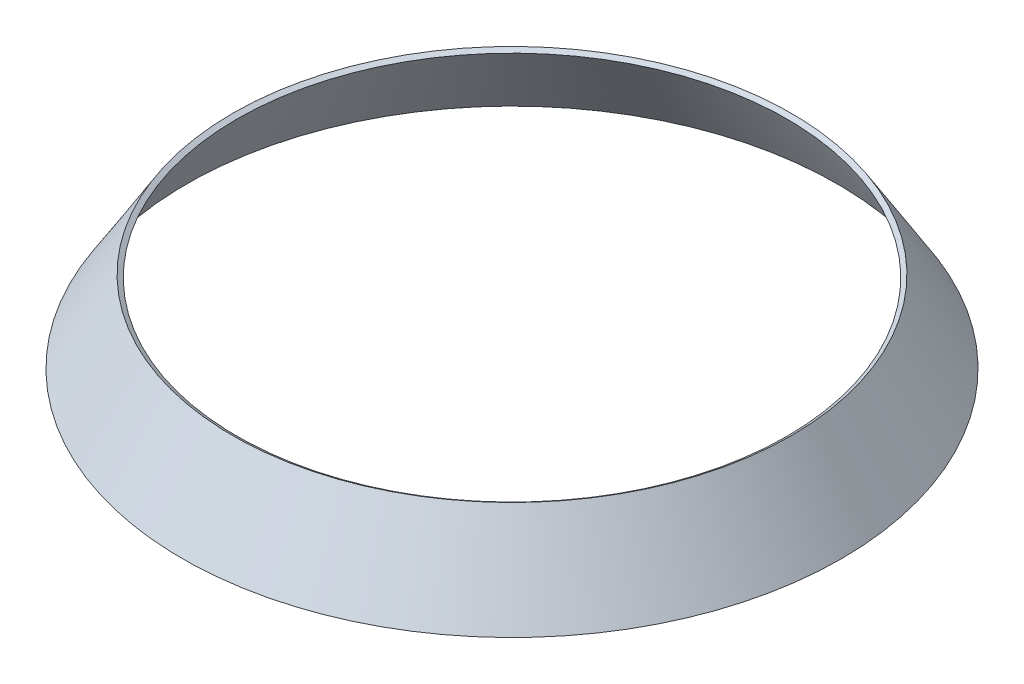
ISO-10303-21;
HEADER;
FILE_DESCRIPTION(('STEP AP214'),'2;1');
FILE_NAME('part.step','',(''),(''),'','','');
FILE_SCHEMA(('AUTOMOTIVE_DESIGN { 1 0 10303 214 1 1 1 1 }'));
ENDSEC;
DATA;
#1=APPLICATION_CONTEXT('core data for automotive mechanical design processes');
#2=APPLICATION_PROTOCOL_DEFINITION('international standard','automotive_design',2000,#1);
#3=PRODUCT_CONTEXT('',#1,'mechanical');
#4=PRODUCT('Part','Part','',(#3));
#5=PRODUCT_RELATED_PRODUCT_CATEGORY('part','',(#4));
#6=PRODUCT_DEFINITION_FORMATION('','',#4);
#7=PRODUCT_DEFINITION_CONTEXT('part definition',#1,'design');
#8=PRODUCT_DEFINITION('design','',#6,#7);
#9=PRODUCT_DEFINITION_SHAPE('','',#8);
#10=(LENGTH_UNIT() NAMED_UNIT(*) SI_UNIT(.MILLI.,.METRE.));
#11=(NAMED_UNIT(*) PLANE_ANGLE_UNIT() SI_UNIT($,.RADIAN.));
#12=(NAMED_UNIT(*) SI_UNIT($,.STERADIAN.) SOLID_ANGLE_UNIT());
#13=UNCERTAINTY_MEASURE_WITH_UNIT(LENGTH_MEASURE(1.E-05),#10,'distance_accuracy_value','');
#14=(GEOMETRIC_REPRESENTATION_CONTEXT(3) GLOBAL_UNCERTAINTY_ASSIGNED_CONTEXT((#13)) GLOBAL_UNIT_ASSIGNED_CONTEXT((#10,
#11,#12)) REPRESENTATION_CONTEXT('',''));
#15=CARTESIAN_POINT('',(0.,0.,0.));
#16=DIRECTION('',(0.,0.,1.));
#17=DIRECTION('',(1.,0.,0.));
#18=AXIS2_PLACEMENT_3D('',#15,#16,#17);
#19=CARTESIAN_POINT('',(0.,5.71418728913131,0.));
#20=DIRECTION('',(0.,1.,0.));
#21=DIRECTION('',(-1.,0.,0.));
#22=AXIS2_PLACEMENT_3D('',#19,#20,#21);
#23=CONICAL_SURFACE('',#22,37.9488685360606,1.0175269539127);
#24=CARTESIAN_POINT('',(0.,5.34635713338072,0.));
#25=DIRECTION('',(0.,-1.,0.));
#26=DIRECTION('',(1.,0.,0.));
#27=AXIS2_PLACEMENT_3D('',#24,#25,#26);
#28=CIRCLE('',#27,37.3533007594638);
#29=CARTESIAN_POINT('',(37.3533007594637,5.34635713338085,0.));
#30=VERTEX_POINT('',#29);
#31=EDGE_CURVE('E10',#30,#30,#28,.T.);
#32=ORIENTED_EDGE('',*,*,#31,.T.);
#33=EDGE_LOOP('',(#32));
#34=FACE_BOUND('',#33,.T.);
#35=CARTESIAN_POINT('',(0.,5.71418728913131,0.));
#36=DIRECTION('',(0.,-1.,0.));
#37=DIRECTION('',(1.,0.,0.));
#38=AXIS2_PLACEMENT_3D('',#35,#36,#37);
#39=CIRCLE('',#38,37.9488685360606);
#40=CARTESIAN_POINT('',(37.9488685360606,5.71418728913144,0.));
#41=VERTEX_POINT('',#40);
#42=EDGE_CURVE('E45',#41,#41,#39,.T.);
#43=ORIENTED_EDGE('',*,*,#42,.F.);
#44=EDGE_LOOP('',(#43));
#45=FACE_BOUND('',#44,.T.);
#46=ADVANCED_FACE('F31',(#34,#45),#23,.F.);
#47=CARTESIAN_POINT('',(0.,5.34635713338072,0.));
#48=DIRECTION('',(0.,-1.,0.));
#49=DIRECTION('',(1.,0.,0.));
#50=AXIS2_PLACEMENT_3D('',#47,#48,#49);
#51=CONICAL_SURFACE('',#50,37.3533007594638,0.553269372882194);
#52=CARTESIAN_POINT('',(0.,-5.71418728913198,0.));
#53=DIRECTION('',(0.,-1.,0.));
#54=DIRECTION('',(1.,0.,0.));
#55=AXIS2_PLACEMENT_3D('',#52,#53,#54);
#56=CIRCLE('',#55,44.1844322234031);
#57=CARTESIAN_POINT('',(44.1844322234031,-5.71418728913183,0.));
#58=VERTEX_POINT('',#57);
#59=EDGE_CURVE('E37',#58,#58,#56,.T.);
#60=ORIENTED_EDGE('',*,*,#59,.T.);
#61=EDGE_LOOP('',(#60));
#62=FACE_BOUND('',#61,.T.);
#63=ORIENTED_EDGE('',*,*,#31,.F.);
#64=EDGE_LOOP('',(#63));
#65=FACE_BOUND('',#64,.T.);
#66=ADVANCED_FACE('F55',(#62,#65),#51,.F.);
#67=CARTESIAN_POINT('',(0.,-5.71418728913198,0.));
#68=DIRECTION('',(0.,1.,0.));
#69=DIRECTION('',(-1.,0.,0.));
#70=AXIS2_PLACEMENT_3D('',#67,#68,#69);
#71=CONICAL_SURFACE('',#70,44.1844322234031,1.0175269539127);
#72=CARTESIAN_POINT('',(0.,-5.34635713338139,0.));
#73=DIRECTION('',(0.,-1.,0.));
#74=DIRECTION('',(1.,0.,0.));
#75=AXIS2_PLACEMENT_3D('',#72,#73,#74);
#76=CIRCLE('',#75,44.78);
#77=CARTESIAN_POINT('',(44.78,-5.34635713338123,0.));
#78=VERTEX_POINT('',#77);
#79=EDGE_CURVE('E41',#78,#78,#76,.T.);
#80=ORIENTED_EDGE('',*,*,#79,.T.);
#81=EDGE_LOOP('',(#80));
#82=FACE_BOUND('',#81,.T.);
#83=ORIENTED_EDGE('',*,*,#59,.F.);
#84=EDGE_LOOP('',(#83));
#85=FACE_BOUND('',#84,.T.);
#86=ADVANCED_FACE('F59',(#82,#85),#71,.T.);
#87=CARTESIAN_POINT('',(0.,-5.34635713338139,0.));
#88=DIRECTION('',(0.,-1.,0.));
#89=DIRECTION('',(1.,0.,0.));
#90=AXIS2_PLACEMENT_3D('',#87,#88,#89);
#91=CONICAL_SURFACE('',#90,44.78,0.553269372882194);
#92=ORIENTED_EDGE('',*,*,#42,.T.);
#93=EDGE_LOOP('',(#92));
#94=FACE_BOUND('',#93,.T.);
#95=ORIENTED_EDGE('',*,*,#79,.F.);
#96=EDGE_LOOP('',(#95));
#97=FACE_BOUND('',#96,.T.);
#98=ADVANCED_FACE('F51',(#94,#97),#91,.T.);
#99=CLOSED_SHELL('',(#46,#66,#86,#98));
#100=MANIFOLD_SOLID_BREP('B2',#99);
#101=ADVANCED_BREP_SHAPE_REPRESENTATION('',(#18,#100),#14);
#102=SHAPE_DEFINITION_REPRESENTATION(#9,#101);
ENDSEC;
END-ISO-10303-21;
